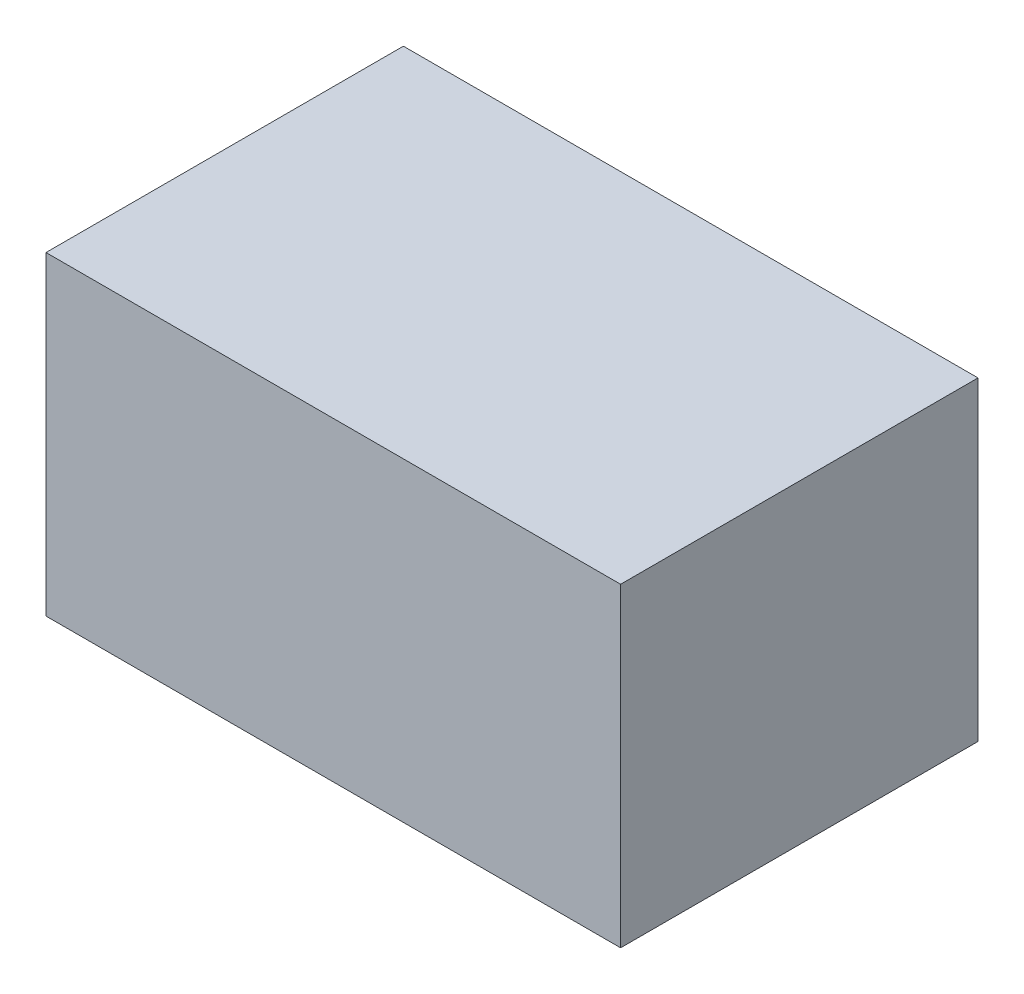
ISO-10303-21;
HEADER;
FILE_DESCRIPTION(('STEP AP214'),'2;1');
FILE_NAME('part.step','',(''),(''),'','','');
FILE_SCHEMA(('AUTOMOTIVE_DESIGN { 1 0 10303 214 1 1 1 1 }'));
ENDSEC;
DATA;
#1=APPLICATION_CONTEXT('core data for automotive mechanical design processes');
#2=APPLICATION_PROTOCOL_DEFINITION('international standard','automotive_design',2000,#1);
#3=PRODUCT_CONTEXT('',#1,'mechanical');
#4=PRODUCT('Part','Part','',(#3));
#5=PRODUCT_RELATED_PRODUCT_CATEGORY('part','',(#4));
#6=PRODUCT_DEFINITION_FORMATION('','',#4);
#7=PRODUCT_DEFINITION_CONTEXT('part definition',#1,'design');
#8=PRODUCT_DEFINITION('design','',#6,#7);
#9=PRODUCT_DEFINITION_SHAPE('','',#8);
#10=(LENGTH_UNIT() NAMED_UNIT(*) SI_UNIT(.MILLI.,.METRE.));
#11=(NAMED_UNIT(*) PLANE_ANGLE_UNIT() SI_UNIT($,.RADIAN.));
#12=(NAMED_UNIT(*) SI_UNIT($,.STERADIAN.) SOLID_ANGLE_UNIT());
#13=UNCERTAINTY_MEASURE_WITH_UNIT(LENGTH_MEASURE(1.E-05),#10,'distance_accuracy_value','');
#14=(GEOMETRIC_REPRESENTATION_CONTEXT(3) GLOBAL_UNCERTAINTY_ASSIGNED_CONTEXT((#13)) GLOBAL_UNIT_ASSIGNED_CONTEXT((#10,
#11,#12)) REPRESENTATION_CONTEXT('',''));
#15=CARTESIAN_POINT('',(0.,0.,0.));
#16=DIRECTION('',(0.,0.,1.));
#17=DIRECTION('',(1.,0.,0.));
#18=AXIS2_PLACEMENT_3D('',#15,#16,#17);
#19=CARTESIAN_POINT('',(-20.0525,15.5175,-19.729));
#20=DIRECTION('',(-1.,0.,0.));
#21=DIRECTION('',(0.,0.,1.));
#22=AXIS2_PLACEMENT_3D('',#19,#20,#21);
#23=PLANE('',#22);
#24=DIRECTION('',(0.,-1.,0.));
#25=VECTOR('',#24,1.);
#26=CARTESIAN_POINT('',(-20.0525,15.5175,0.));
#27=LINE('',#26,#25);
#28=CARTESIAN_POINT('',(-20.0525,15.5175,0.));
#29=VERTEX_POINT('',#28);
#30=CARTESIAN_POINT('',(-20.0525,-1.8635,0.));
#31=VERTEX_POINT('',#30);
#32=EDGE_CURVE('E103',#29,#31,#27,.T.);
#33=ORIENTED_EDGE('',*,*,#32,.F.);
#34=DIRECTION('',(0.,0.,1.));
#35=VECTOR('',#34,1.);
#36=CARTESIAN_POINT('',(-20.0525,15.5175,-19.729));
#37=LINE('',#36,#35);
#38=CARTESIAN_POINT('',(-20.0525,15.5175,-19.729));
#39=VERTEX_POINT('',#38);
#40=EDGE_CURVE('E11',#39,#29,#37,.T.);
#41=ORIENTED_EDGE('',*,*,#40,.F.);
#42=DIRECTION('',(0.,-1.,0.));
#43=VECTOR('',#42,1.);
#44=CARTESIAN_POINT('',(-20.0525,15.5175,-19.729));
#45=LINE('',#44,#43);
#46=CARTESIAN_POINT('',(-20.0525,-1.8635,-19.729));
#47=VERTEX_POINT('',#46);
#48=EDGE_CURVE('E98',#39,#47,#45,.T.);
#49=ORIENTED_EDGE('',*,*,#48,.T.);
#50=DIRECTION('',(0.,0.,1.));
#51=VECTOR('',#50,1.);
#52=CARTESIAN_POINT('',(-20.0525,-1.8635,-19.729));
#53=LINE('',#52,#51);
#54=EDGE_CURVE('E42',#47,#31,#53,.T.);
#55=ORIENTED_EDGE('',*,*,#54,.T.);
#56=EDGE_LOOP('',(#33,#41,#49,#55));
#57=FACE_BOUND('',#56,.T.);
#58=ADVANCED_FACE('F41',(#57),#23,.T.);
#59=CARTESIAN_POINT('',(11.6665,15.5175,-19.729));
#60=DIRECTION('',(0.,1.,0.));
#61=DIRECTION('',(0.,0.,1.));
#62=AXIS2_PLACEMENT_3D('',#59,#60,#61);
#63=PLANE('',#62);
#64=DIRECTION('',(-1.,0.,0.));
#65=VECTOR('',#64,1.);
#66=CARTESIAN_POINT('',(11.6665,15.5175,0.));
#67=LINE('',#66,#65);
#68=CARTESIAN_POINT('',(11.6665,15.5175,0.));
#69=VERTEX_POINT('',#68);
#70=EDGE_CURVE('E102',#69,#29,#67,.T.);
#71=ORIENTED_EDGE('',*,*,#70,.F.);
#72=DIRECTION('',(0.,0.,1.));
#73=VECTOR('',#72,1.);
#74=CARTESIAN_POINT('',(11.6665,15.5175,-19.729));
#75=LINE('',#74,#73);
#76=CARTESIAN_POINT('',(11.6665,15.5175,-19.729));
#77=VERTEX_POINT('',#76);
#78=EDGE_CURVE('E49',#77,#69,#75,.T.);
#79=ORIENTED_EDGE('',*,*,#78,.F.);
#80=DIRECTION('',(-1.,0.,0.));
#81=VECTOR('',#80,1.);
#82=CARTESIAN_POINT('',(11.6665,15.5175,-19.729));
#83=LINE('',#82,#81);
#84=EDGE_CURVE('E96',#77,#39,#83,.T.);
#85=ORIENTED_EDGE('',*,*,#84,.T.);
#86=ORIENTED_EDGE('',*,*,#40,.T.);
#87=EDGE_LOOP('',(#71,#79,#85,#86));
#88=FACE_BOUND('',#87,.T.);
#89=ADVANCED_FACE('F113',(#88),#63,.T.);
#90=CARTESIAN_POINT('',(11.6665,-1.8635,-19.729));
#91=DIRECTION('',(1.,0.,0.));
#92=DIRECTION('',(0.,0.,-1.));
#93=AXIS2_PLACEMENT_3D('',#90,#91,#92);
#94=PLANE('',#93);
#95=DIRECTION('',(0.,1.,0.));
#96=VECTOR('',#95,1.);
#97=CARTESIAN_POINT('',(11.6665,-1.8635,0.));
#98=LINE('',#97,#96);
#99=CARTESIAN_POINT('',(11.6665,-1.8635,0.));
#100=VERTEX_POINT('',#99);
#101=EDGE_CURVE('E91',#100,#69,#98,.T.);
#102=ORIENTED_EDGE('',*,*,#101,.F.);
#103=DIRECTION('',(0.,0.,1.));
#104=VECTOR('',#103,1.);
#105=CARTESIAN_POINT('',(11.6665,-1.8635,-19.729));
#106=LINE('',#105,#104);
#107=CARTESIAN_POINT('',(11.6665,-1.8635,-19.729));
#108=VERTEX_POINT('',#107);
#109=EDGE_CURVE('E86',#108,#100,#106,.T.);
#110=ORIENTED_EDGE('',*,*,#109,.F.);
#111=DIRECTION('',(0.,1.,0.));
#112=VECTOR('',#111,1.);
#113=CARTESIAN_POINT('',(11.6665,-1.8635,-19.729));
#114=LINE('',#113,#112);
#115=EDGE_CURVE('E87',#108,#77,#114,.T.);
#116=ORIENTED_EDGE('',*,*,#115,.T.);
#117=ORIENTED_EDGE('',*,*,#78,.T.);
#118=EDGE_LOOP('',(#102,#110,#116,#117));
#119=FACE_BOUND('',#118,.T.);
#120=ADVANCED_FACE('F88',(#119),#94,.T.);
#121=CARTESIAN_POINT('',(-20.0525,-1.8635,-19.729));
#122=DIRECTION('',(0.,-1.,0.));
#123=DIRECTION('',(0.,0.,-1.));
#124=AXIS2_PLACEMENT_3D('',#121,#122,#123);
#125=PLANE('',#124);
#126=DIRECTION('',(1.,0.,0.));
#127=VECTOR('',#126,1.);
#128=CARTESIAN_POINT('',(-20.0525,-1.8635,0.));
#129=LINE('',#128,#127);
#130=EDGE_CURVE('E110',#31,#100,#129,.T.);
#131=ORIENTED_EDGE('',*,*,#130,.F.);
#132=ORIENTED_EDGE('',*,*,#54,.F.);
#133=DIRECTION('',(1.,0.,0.));
#134=VECTOR('',#133,1.);
#135=CARTESIAN_POINT('',(-20.0525,-1.8635,-19.729));
#136=LINE('',#135,#134);
#137=EDGE_CURVE('E94',#47,#108,#136,.T.);
#138=ORIENTED_EDGE('',*,*,#137,.T.);
#139=ORIENTED_EDGE('',*,*,#109,.T.);
#140=EDGE_LOOP('',(#131,#132,#138,#139));
#141=FACE_BOUND('',#140,.T.);
#142=ADVANCED_FACE('F97',(#141),#125,.T.);
#143=CARTESIAN_POINT('',(0.,0.,-19.729));
#144=DIRECTION('',(0.,0.,1.));
#145=DIRECTION('',(1.,0.,0.));
#146=AXIS2_PLACEMENT_3D('',#143,#144,#145);
#147=PLANE('',#146);
#148=ORIENTED_EDGE('',*,*,#48,.F.);
#149=ORIENTED_EDGE('',*,*,#84,.F.);
#150=ORIENTED_EDGE('',*,*,#115,.F.);
#151=ORIENTED_EDGE('',*,*,#137,.F.);
#152=EDGE_LOOP('',(#148,#149,#150,#151));
#153=FACE_BOUND('',#152,.T.);
#154=ADVANCED_FACE('F92',(#153),#147,.F.);
#155=CARTESIAN_POINT('',(0.,0.,0.));
#156=DIRECTION('',(0.,0.,1.));
#157=DIRECTION('',(1.,0.,0.));
#158=AXIS2_PLACEMENT_3D('',#155,#156,#157);
#159=PLANE('',#158);
#160=ORIENTED_EDGE('',*,*,#32,.T.);
#161=ORIENTED_EDGE('',*,*,#130,.T.);
#162=ORIENTED_EDGE('',*,*,#101,.T.);
#163=ORIENTED_EDGE('',*,*,#70,.T.);
#164=EDGE_LOOP('',(#160,#161,#162,#163));
#165=FACE_BOUND('',#164,.T.);
#166=ADVANCED_FACE('F114',(#165),#159,.T.);
#167=CLOSED_SHELL('',(#58,#89,#120,#142,#154,#166));
#168=MANIFOLD_SOLID_BREP('B2',#167);
#169=ADVANCED_BREP_SHAPE_REPRESENTATION('',(#18,#168),#14);
#170=SHAPE_DEFINITION_REPRESENTATION(#9,#169);
ENDSEC;
END-ISO-10303-21;
